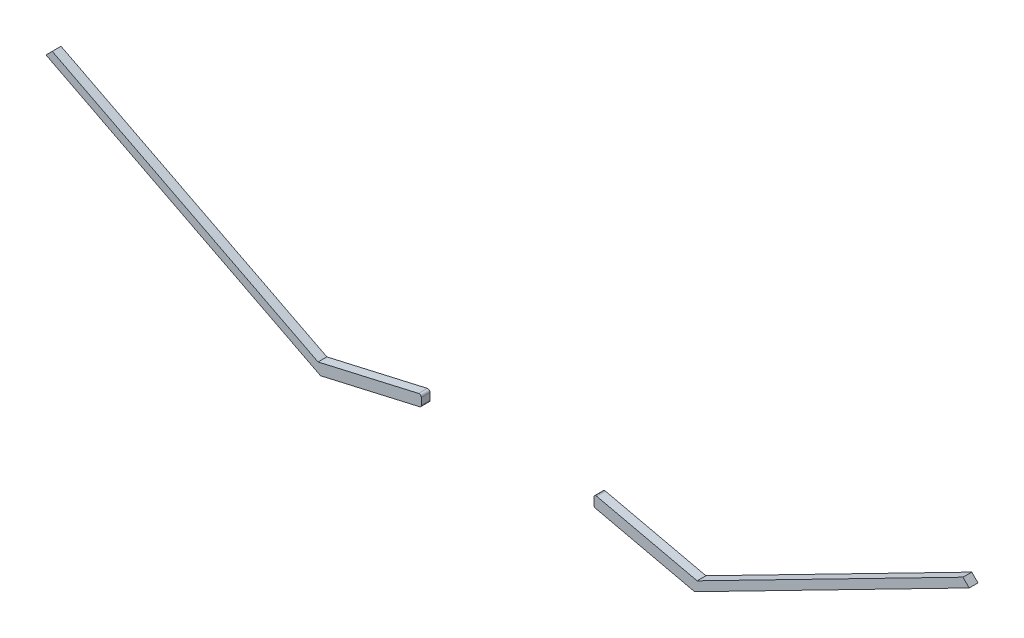
ISO-10303-21;
HEADER;
FILE_DESCRIPTION(('STEP AP214'),'2;1');
FILE_NAME('part.step','',(''),(''),'','','');
FILE_SCHEMA(('AUTOMOTIVE_DESIGN { 1 0 10303 214 1 1 1 1 }'));
ENDSEC;
DATA;
#1=APPLICATION_CONTEXT('core data for automotive mechanical design processes');
#2=APPLICATION_PROTOCOL_DEFINITION('international standard','automotive_design',2000,#1);
#3=PRODUCT_CONTEXT('',#1,'mechanical');
#4=PRODUCT('Part','Part','',(#3));
#5=PRODUCT_RELATED_PRODUCT_CATEGORY('part','',(#4));
#6=PRODUCT_DEFINITION_FORMATION('','',#4);
#7=PRODUCT_DEFINITION_CONTEXT('part definition',#1,'design');
#8=PRODUCT_DEFINITION('design','',#6,#7);
#9=PRODUCT_DEFINITION_SHAPE('','',#8);
#10=(LENGTH_UNIT() NAMED_UNIT(*) SI_UNIT(.MILLI.,.METRE.));
#11=(NAMED_UNIT(*) PLANE_ANGLE_UNIT() SI_UNIT($,.RADIAN.));
#12=(NAMED_UNIT(*) SI_UNIT($,.STERADIAN.) SOLID_ANGLE_UNIT());
#13=UNCERTAINTY_MEASURE_WITH_UNIT(LENGTH_MEASURE(1.E-05),#10,'distance_accuracy_value','');
#14=(GEOMETRIC_REPRESENTATION_CONTEXT(3) GLOBAL_UNCERTAINTY_ASSIGNED_CONTEXT((#13)) GLOBAL_UNIT_ASSIGNED_CONTEXT((#10,
#11,#12)) REPRESENTATION_CONTEXT('',''));
#15=CARTESIAN_POINT('',(0.,0.,0.));
#16=DIRECTION('',(0.,0.,1.));
#17=DIRECTION('',(1.,0.,0.));
#18=AXIS2_PLACEMENT_3D('',#15,#16,#17);
#19=CARTESIAN_POINT('',(20.1115741658573,-9.5000261124462,2.));
#20=DIRECTION('',(0.,0.,-1.));
#21=DIRECTION('',(-1.,0.,0.));
#22=AXIS2_PLACEMENT_3D('',#19,#20,#21);
#23=CYLINDRICAL_SURFACE('',#22,0.499999999999999);
#24=CARTESIAN_POINT('',(20.1115741658573,-9.5000261124462,0.));
#25=DIRECTION('',(0.,0.,1.));
#26=DIRECTION('',(1.,0.,0.));
#27=AXIS2_PLACEMENT_3D('',#24,#25,#26);
#28=CIRCLE('',#27,0.499999999999999);
#29=CARTESIAN_POINT('',(20.2231483317146,-9.01263386228905,0.));
#30=VERTEX_POINT('',#29);
#31=CARTESIAN_POINT('',(19.6115741658573,-9.5000261124462,0.));
#32=VERTEX_POINT('',#31);
#33=EDGE_CURVE('E139',#30,#32,#28,.T.);
#34=ORIENTED_EDGE('',*,*,#33,.T.);
#35=DIRECTION('',(0.,0.,-1.));
#36=VECTOR('',#35,1.);
#37=CARTESIAN_POINT('',(19.6115741658573,-9.5000261124462,2.));
#38=LINE('',#37,#36);
#39=CARTESIAN_POINT('',(19.6115741658573,-9.5000261124462,2.));
#40=VERTEX_POINT('',#39);
#41=EDGE_CURVE('E12',#40,#32,#38,.T.);
#42=ORIENTED_EDGE('',*,*,#41,.F.);
#43=CARTESIAN_POINT('',(20.1115741658573,-9.5000261124462,2.));
#44=DIRECTION('',(0.,0.,1.));
#45=DIRECTION('',(1.,0.,0.));
#46=AXIS2_PLACEMENT_3D('',#43,#44,#45);
#47=CIRCLE('',#46,0.499999999999999);
#48=CARTESIAN_POINT('',(20.2231483317146,-9.01263386228905,2.));
#49=VERTEX_POINT('',#48);
#50=EDGE_CURVE('E153',#49,#40,#47,.T.);
#51=ORIENTED_EDGE('',*,*,#50,.F.);
#52=DIRECTION('',(0.,0.,-1.));
#53=VECTOR('',#52,1.);
#54=CARTESIAN_POINT('',(20.2231483317146,-9.01263386228905,2.));
#55=LINE('',#54,#53);
#56=EDGE_CURVE('E135',#49,#30,#55,.T.);
#57=ORIENTED_EDGE('',*,*,#56,.T.);
#58=EDGE_LOOP('',(#34,#42,#51,#57));
#59=FACE_BOUND('',#58,.T.);
#60=ADVANCED_FACE('F43',(#59),#23,.T.);
#61=CARTESIAN_POINT('',(19.6115741658573,-9.5000261124462,2.));
#62=DIRECTION('',(1.,0.,0.));
#63=DIRECTION('',(0.,0.,-1.));
#64=AXIS2_PLACEMENT_3D('',#61,#62,#63);
#65=PLANE('',#64);
#66=DIRECTION('',(0.,-1.,0.));
#67=VECTOR('',#66,1.);
#68=CARTESIAN_POINT('',(19.6115741658573,-9.5000261124462,0.));
#69=LINE('',#68,#67);
#70=CARTESIAN_POINT('',(19.6115741658573,-11.0388277650334,0.));
#71=VERTEX_POINT('',#70);
#72=EDGE_CURVE('E142',#32,#71,#69,.T.);
#73=ORIENTED_EDGE('',*,*,#72,.T.);
#74=DIRECTION('',(0.,0.,-1.));
#75=VECTOR('',#74,1.);
#76=CARTESIAN_POINT('',(19.6115741658573,-11.0388277650334,2.));
#77=LINE('',#76,#75);
#78=CARTESIAN_POINT('',(19.6115741658573,-11.0388277650334,2.));
#79=VERTEX_POINT('',#78);
#80=EDGE_CURVE('E51',#79,#71,#77,.T.);
#81=ORIENTED_EDGE('',*,*,#80,.F.);
#82=DIRECTION('',(0.,-1.,0.));
#83=VECTOR('',#82,1.);
#84=CARTESIAN_POINT('',(19.6115741658573,-9.5000261124462,2.));
#85=LINE('',#84,#83);
#86=EDGE_CURVE('E102',#40,#79,#85,.T.);
#87=ORIENTED_EDGE('',*,*,#86,.F.);
#88=ORIENTED_EDGE('',*,*,#41,.T.);
#89=EDGE_LOOP('',(#73,#81,#87,#88));
#90=FACE_BOUND('',#89,.T.);
#91=ADVANCED_FACE('F188',(#90),#65,.F.);
#92=CARTESIAN_POINT('',(20.1115741658573,-11.0388277650334,2.));
#93=DIRECTION('',(0.,0.,-1.));
#94=DIRECTION('',(-1.,0.,0.));
#95=AXIS2_PLACEMENT_3D('',#92,#93,#94);
#96=CYLINDRICAL_SURFACE('',#95,0.5);
#97=CARTESIAN_POINT('',(20.1115741658573,-11.0388277650334,0.));
#98=DIRECTION('',(0.,0.,1.));
#99=DIRECTION('',(1.,0.,0.));
#100=AXIS2_PLACEMENT_3D('',#97,#98,#99);
#101=CIRCLE('',#100,0.5);
#102=CARTESIAN_POINT('',(20.,-11.5262200151905,0.));
#103=VERTEX_POINT('',#102);
#104=EDGE_CURVE('E144',#71,#103,#101,.T.);
#105=ORIENTED_EDGE('',*,*,#104,.T.);
#106=DIRECTION('',(0.,0.,-1.));
#107=VECTOR('',#106,1.);
#108=CARTESIAN_POINT('',(20.,-11.5262200151905,2.));
#109=LINE('',#108,#107);
#110=CARTESIAN_POINT('',(20.,-11.5262200151905,2.));
#111=VERTEX_POINT('',#110);
#112=EDGE_CURVE('E160',#111,#103,#109,.T.);
#113=ORIENTED_EDGE('',*,*,#112,.F.);
#114=CARTESIAN_POINT('',(20.1115741658573,-11.0388277650334,2.));
#115=DIRECTION('',(0.,0.,1.));
#116=DIRECTION('',(1.,0.,0.));
#117=AXIS2_PLACEMENT_3D('',#114,#115,#116);
#118=CIRCLE('',#117,0.5);
#119=EDGE_CURVE('E168',#79,#111,#118,.T.);
#120=ORIENTED_EDGE('',*,*,#119,.F.);
#121=ORIENTED_EDGE('',*,*,#80,.T.);
#122=EDGE_LOOP('',(#105,#113,#120,#121));
#123=FACE_BOUND('',#122,.T.);
#124=ADVANCED_FACE('F166',(#123),#96,.T.);
#125=CARTESIAN_POINT('',(20.,-11.5262200151905,2.));
#126=DIRECTION('',(0.223148331714566,0.974784500314303,0.));
#127=DIRECTION('',(-0.974784500314304,0.223148331714566,0.));
#128=AXIS2_PLACEMENT_3D('',#125,#126,#127);
#129=PLANE('',#128);
#130=DIRECTION('',(0.974784500314303,-0.223148331714566,0.));
#131=VECTOR('',#130,1.);
#132=CARTESIAN_POINT('',(20.,-11.5262200151905,0.));
#133=LINE('',#132,#131);
#134=CARTESIAN_POINT('',(42.5,-16.6769353394071,0.));
#135=VERTEX_POINT('',#134);
#136=EDGE_CURVE('E146',#103,#135,#133,.T.);
#137=ORIENTED_EDGE('',*,*,#136,.T.);
#138=DIRECTION('',(0.,0.,-1.));
#139=VECTOR('',#138,1.);
#140=CARTESIAN_POINT('',(42.5,-16.6769353394071,2.));
#141=LINE('',#140,#139);
#142=CARTESIAN_POINT('',(42.5,-16.6769353394071,2.));
#143=VERTEX_POINT('',#142);
#144=EDGE_CURVE('E157',#143,#135,#141,.T.);
#145=ORIENTED_EDGE('',*,*,#144,.F.);
#146=DIRECTION('',(0.974784500314303,-0.223148331714566,0.));
#147=VECTOR('',#146,1.);
#148=CARTESIAN_POINT('',(20.,-11.5262200151905,2.));
#149=LINE('',#148,#147);
#150=EDGE_CURVE('E180',#111,#143,#149,.T.);
#151=ORIENTED_EDGE('',*,*,#150,.F.);
#152=ORIENTED_EDGE('',*,*,#112,.T.);
#153=EDGE_LOOP('',(#137,#145,#151,#152));
#154=FACE_BOUND('',#153,.T.);
#155=ADVANCED_FACE('F176',(#154),#129,.F.);
#156=CARTESIAN_POINT('',(42.5,-16.6769353394071,2.));
#157=DIRECTION('',(-0.455637859415307,0.890165232452626,0.));
#158=DIRECTION('',(-0.890165232452626,-0.455637859415307,0.));
#159=AXIS2_PLACEMENT_3D('',#156,#157,#158);
#160=PLANE('',#159);
#161=DIRECTION('',(0.890165232452626,0.455637859415307,0.));
#162=VECTOR('',#161,1.);
#163=CARTESIAN_POINT('',(42.5,-16.6769353394071,0.));
#164=LINE('',#163,#162);
#165=CARTESIAN_POINT('',(104.899494936612,15.262721777034,0.));
#166=VERTEX_POINT('',#165);
#167=EDGE_CURVE('E148',#135,#166,#164,.T.);
#168=ORIENTED_EDGE('',*,*,#167,.T.);
#169=DIRECTION('',(0.,0.,-1.));
#170=VECTOR('',#169,1.);
#171=CARTESIAN_POINT('',(104.899494936612,15.262721777034,2.));
#172=LINE('',#171,#170);
#173=CARTESIAN_POINT('',(104.899494936612,15.262721777034,2.));
#174=VERTEX_POINT('',#173);
#175=EDGE_CURVE('E130',#174,#166,#172,.T.);
#176=ORIENTED_EDGE('',*,*,#175,.F.);
#177=DIRECTION('',(0.890165232452626,0.455637859415307,0.));
#178=VECTOR('',#177,1.);
#179=CARTESIAN_POINT('',(42.5,-16.6769353394071,2.));
#180=LINE('',#179,#178);
#181=EDGE_CURVE('E121',#143,#174,#180,.T.);
#182=ORIENTED_EDGE('',*,*,#181,.F.);
#183=ORIENTED_EDGE('',*,*,#144,.T.);
#184=EDGE_LOOP('',(#168,#176,#182,#183));
#185=FACE_BOUND('',#184,.T.);
#186=ADVANCED_FACE('F179',(#185),#160,.F.);
#187=CARTESIAN_POINT('',(104.899494936612,15.262721777034,2.));
#188=DIRECTION('',(-0.707106781186547,-0.707106781186547,0.));
#189=DIRECTION('',(0.707106781186548,-0.707106781186548,0.));
#190=AXIS2_PLACEMENT_3D('',#187,#188,#189);
#191=PLANE('',#190);
#192=DIRECTION('',(-0.707106781186547,0.707106781186547,0.));
#193=VECTOR('',#192,1.);
#194=CARTESIAN_POINT('',(104.899494936612,15.262721777034,0.));
#195=LINE('',#194,#193);
#196=CARTESIAN_POINT('',(103.485281374239,16.6769353394071,0.));
#197=VERTEX_POINT('',#196);
#198=EDGE_CURVE('E129',#166,#197,#195,.T.);
#199=ORIENTED_EDGE('',*,*,#198,.T.);
#200=DIRECTION('',(0.,0.,-1.));
#201=VECTOR('',#200,1.);
#202=CARTESIAN_POINT('',(103.485281374239,16.6769353394071,2.));
#203=LINE('',#202,#201);
#204=CARTESIAN_POINT('',(103.485281374239,16.6769353394071,2.));
#205=VERTEX_POINT('',#204);
#206=EDGE_CURVE('E126',#205,#197,#203,.T.);
#207=ORIENTED_EDGE('',*,*,#206,.F.);
#208=DIRECTION('',(-0.707106781186547,0.707106781186547,0.));
#209=VECTOR('',#208,1.);
#210=CARTESIAN_POINT('',(104.899494936612,15.262721777034,2.));
#211=LINE('',#210,#209);
#212=EDGE_CURVE('E115',#174,#205,#211,.T.);
#213=ORIENTED_EDGE('',*,*,#212,.F.);
#214=ORIENTED_EDGE('',*,*,#175,.T.);
#215=EDGE_LOOP('',(#199,#207,#213,#214));
#216=FACE_BOUND('',#215,.T.);
#217=ADVANCED_FACE('F127',(#216),#191,.F.);
#218=CARTESIAN_POINT('',(103.485281374239,16.6769353394071,2.));
#219=DIRECTION('',(0.455637859415307,-0.890165232452626,0.));
#220=DIRECTION('',(0.890165232452626,0.455637859415307,0.));
#221=AXIS2_PLACEMENT_3D('',#218,#219,#220);
#222=PLANE('',#221);
#223=DIRECTION('',(-0.890165232452626,-0.455637859415307,0.));
#224=VECTOR('',#223,1.);
#225=CARTESIAN_POINT('',(103.485281374239,16.6769353394071,0.));
#226=LINE('',#225,#224);
#227=CARTESIAN_POINT('',(43.0758536191276,-14.2440907211195,0.));
#228=VERTEX_POINT('',#227);
#229=EDGE_CURVE('E88',#197,#228,#226,.T.);
#230=ORIENTED_EDGE('',*,*,#229,.T.);
#231=DIRECTION('',(0.,0.,-1.));
#232=VECTOR('',#231,1.);
#233=CARTESIAN_POINT('',(43.0758536191276,-14.2440907211195,2.));
#234=LINE('',#233,#232);
#235=CARTESIAN_POINT('',(43.0758536191276,-14.2440907211195,2.));
#236=VERTEX_POINT('',#235);
#237=EDGE_CURVE('E131',#236,#228,#234,.T.);
#238=ORIENTED_EDGE('',*,*,#237,.F.);
#239=DIRECTION('',(-0.890165232452626,-0.455637859415307,0.));
#240=VECTOR('',#239,1.);
#241=CARTESIAN_POINT('',(103.485281374239,16.6769353394071,2.));
#242=LINE('',#241,#240);
#243=EDGE_CURVE('E119',#205,#236,#242,.T.);
#244=ORIENTED_EDGE('',*,*,#243,.F.);
#245=ORIENTED_EDGE('',*,*,#206,.T.);
#246=EDGE_LOOP('',(#230,#238,#244,#245));
#247=FACE_BOUND('',#246,.T.);
#248=ADVANCED_FACE('F133',(#247),#222,.F.);
#249=CARTESIAN_POINT('',(43.0758536191276,-14.2440907211195,2.));
#250=DIRECTION('',(-0.223148331714565,-0.974784500314304,0.));
#251=DIRECTION('',(0.974784500314304,-0.223148331714565,0.));
#252=AXIS2_PLACEMENT_3D('',#249,#250,#251);
#253=PLANE('',#252);
#254=DIRECTION('',(-0.974784500314304,0.223148331714565,0.));
#255=VECTOR('',#254,1.);
#256=CARTESIAN_POINT('',(43.0758536191276,-14.2440907211195,0.));
#257=LINE('',#256,#255);
#258=EDGE_CURVE('E94',#228,#30,#257,.T.);
#259=ORIENTED_EDGE('',*,*,#258,.T.);
#260=ORIENTED_EDGE('',*,*,#56,.F.);
#261=DIRECTION('',(-0.974784500314304,0.223148331714565,0.));
#262=VECTOR('',#261,1.);
#263=CARTESIAN_POINT('',(43.0758536191276,-14.2440907211195,2.));
#264=LINE('',#263,#262);
#265=EDGE_CURVE('E59',#236,#49,#264,.T.);
#266=ORIENTED_EDGE('',*,*,#265,.F.);
#267=ORIENTED_EDGE('',*,*,#237,.T.);
#268=EDGE_LOOP('',(#259,#260,#266,#267));
#269=FACE_BOUND('',#268,.T.);
#270=ADVANCED_FACE('F204',(#269),#253,.F.);
#271=CARTESIAN_POINT('',(20.1115741658573,-9.5000261124462,2.));
#272=DIRECTION('',(0.,0.,1.));
#273=DIRECTION('',(1.,0.,0.));
#274=AXIS2_PLACEMENT_3D('',#271,#272,#273);
#275=PLANE('',#274);
#276=ORIENTED_EDGE('',*,*,#50,.T.);
#277=ORIENTED_EDGE('',*,*,#86,.T.);
#278=ORIENTED_EDGE('',*,*,#119,.T.);
#279=ORIENTED_EDGE('',*,*,#150,.T.);
#280=ORIENTED_EDGE('',*,*,#181,.T.);
#281=ORIENTED_EDGE('',*,*,#212,.T.);
#282=ORIENTED_EDGE('',*,*,#243,.T.);
#283=ORIENTED_EDGE('',*,*,#265,.T.);
#284=EDGE_LOOP('',(#276,#277,#278,#279,#280,#281,#282,#283));
#285=FACE_BOUND('',#284,.T.);
#286=ADVANCED_FACE('F117',(#285),#275,.T.);
#287=CARTESIAN_POINT('',(20.1115741658573,-9.5000261124462,0.));
#288=DIRECTION('',(0.,0.,1.));
#289=DIRECTION('',(1.,0.,0.));
#290=AXIS2_PLACEMENT_3D('',#287,#288,#289);
#291=PLANE('',#290);
#292=ORIENTED_EDGE('',*,*,#33,.F.);
#293=ORIENTED_EDGE('',*,*,#258,.F.);
#294=ORIENTED_EDGE('',*,*,#229,.F.);
#295=ORIENTED_EDGE('',*,*,#198,.F.);
#296=ORIENTED_EDGE('',*,*,#167,.F.);
#297=ORIENTED_EDGE('',*,*,#136,.F.);
#298=ORIENTED_EDGE('',*,*,#104,.F.);
#299=ORIENTED_EDGE('',*,*,#72,.F.);
#300=EDGE_LOOP('',(#292,#293,#294,#295,#296,#297,#298,#299));
#301=FACE_BOUND('',#300,.T.);
#302=ADVANCED_FACE('F172',(#301),#291,.F.);
#303=CLOSED_SHELL('',(#60,#91,#124,#155,#186,#217,#248,#270,#286,#302));
#304=MANIFOLD_SOLID_BREP('B2',#303);
#305=CARTESIAN_POINT('',(-104.899494936612,15.262721777034,2.));
#306=DIRECTION('',(0.707106781186547,-0.707106781186547,0.));
#307=DIRECTION('',(0.707106781186548,0.707106781186548,0.));
#308=AXIS2_PLACEMENT_3D('',#305,#306,#307);
#309=PLANE('',#308);
#310=DIRECTION('',(-0.707106781186547,-0.707106781186547,0.));
#311=VECTOR('',#310,1.);
#312=CARTESIAN_POINT('',(-104.899494936612,15.262721777034,0.));
#313=LINE('',#312,#311);
#314=CARTESIAN_POINT('',(-103.485281374239,16.6769353394071,0.));
#315=VERTEX_POINT('',#314);
#316=CARTESIAN_POINT('',(-104.899494936612,15.262721777034,0.));
#317=VERTEX_POINT('',#316);
#318=EDGE_CURVE('E367',#315,#317,#313,.T.);
#319=ORIENTED_EDGE('',*,*,#318,.T.);
#320=DIRECTION('',(0.,0.,-1.));
#321=VECTOR('',#320,1.);
#322=CARTESIAN_POINT('',(-104.899494936612,15.262721777034,2.));
#323=LINE('',#322,#321);
#324=CARTESIAN_POINT('',(-104.899494936612,15.262721777034,2.));
#325=VERTEX_POINT('',#324);
#326=EDGE_CURVE('E41',#325,#317,#323,.T.);
#327=ORIENTED_EDGE('',*,*,#326,.F.);
#328=DIRECTION('',(-0.707106781186547,-0.707106781186547,0.));
#329=VECTOR('',#328,1.);
#330=CARTESIAN_POINT('',(-104.899494936612,15.262721777034,2.));
#331=LINE('',#330,#329);
#332=CARTESIAN_POINT('',(-103.485281374239,16.6769353394071,2.));
#333=VERTEX_POINT('',#332);
#334=EDGE_CURVE('E381',#333,#325,#331,.T.);
#335=ORIENTED_EDGE('',*,*,#334,.F.);
#336=DIRECTION('',(0.,0.,-1.));
#337=VECTOR('',#336,1.);
#338=CARTESIAN_POINT('',(-103.485281374239,16.6769353394071,2.));
#339=LINE('',#338,#337);
#340=EDGE_CURVE('E363',#333,#315,#339,.T.);
#341=ORIENTED_EDGE('',*,*,#340,.T.);
#342=EDGE_LOOP('',(#319,#327,#335,#341));
#343=FACE_BOUND('',#342,.T.);
#344=ADVANCED_FACE('F271',(#343),#309,.F.);
#345=CARTESIAN_POINT('',(-42.5,-16.6769353394071,2.));
#346=DIRECTION('',(0.455637859415307,0.890165232452626,0.));
#347=DIRECTION('',(-0.890165232452626,0.455637859415307,0.));
#348=AXIS2_PLACEMENT_3D('',#345,#346,#347);
#349=PLANE('',#348);
#350=DIRECTION('',(0.890165232452626,-0.455637859415307,0.));
#351=VECTOR('',#350,1.);
#352=CARTESIAN_POINT('',(-42.5,-16.6769353394071,0.));
#353=LINE('',#352,#351);
#354=CARTESIAN_POINT('',(-42.5,-16.6769353394071,0.));
#355=VERTEX_POINT('',#354);
#356=EDGE_CURVE('E370',#317,#355,#353,.T.);
#357=ORIENTED_EDGE('',*,*,#356,.T.);
#358=DIRECTION('',(0.,0.,-1.));
#359=VECTOR('',#358,1.);
#360=CARTESIAN_POINT('',(-42.5,-16.6769353394071,2.));
#361=LINE('',#360,#359);
#362=CARTESIAN_POINT('',(-42.5,-16.6769353394071,2.));
#363=VERTEX_POINT('',#362);
#364=EDGE_CURVE('E279',#363,#355,#361,.T.);
#365=ORIENTED_EDGE('',*,*,#364,.F.);
#366=DIRECTION('',(0.890165232452626,-0.455637859415307,0.));
#367=VECTOR('',#366,1.);
#368=CARTESIAN_POINT('',(-42.5,-16.6769353394071,2.));
#369=LINE('',#368,#367);
#370=EDGE_CURVE('E330',#325,#363,#369,.T.);
#371=ORIENTED_EDGE('',*,*,#370,.F.);
#372=ORIENTED_EDGE('',*,*,#326,.T.);
#373=EDGE_LOOP('',(#357,#365,#371,#372));
#374=FACE_BOUND('',#373,.T.);
#375=ADVANCED_FACE('F416',(#374),#349,.F.);
#376=CARTESIAN_POINT('',(-20.,-11.5262200151905,2.));
#377=DIRECTION('',(-0.223148331714566,0.974784500314303,0.));
#378=DIRECTION('',(-0.974784500314303,-0.223148331714566,0.));
#379=AXIS2_PLACEMENT_3D('',#376,#377,#378);
#380=PLANE('',#379);
#381=DIRECTION('',(0.974784500314303,0.223148331714566,0.));
#382=VECTOR('',#381,1.);
#383=CARTESIAN_POINT('',(-20.,-11.5262200151905,0.));
#384=LINE('',#383,#382);
#385=CARTESIAN_POINT('',(-20.,-11.5262200151905,0.));
#386=VERTEX_POINT('',#385);
#387=EDGE_CURVE('E372',#355,#386,#384,.T.);
#388=ORIENTED_EDGE('',*,*,#387,.T.);
#389=DIRECTION('',(0.,0.,-1.));
#390=VECTOR('',#389,1.);
#391=CARTESIAN_POINT('',(-20.,-11.5262200151905,2.));
#392=LINE('',#391,#390);
#393=CARTESIAN_POINT('',(-20.,-11.5262200151905,2.));
#394=VERTEX_POINT('',#393);
#395=EDGE_CURVE('E388',#394,#386,#392,.T.);
#396=ORIENTED_EDGE('',*,*,#395,.F.);
#397=DIRECTION('',(0.974784500314303,0.223148331714566,0.));
#398=VECTOR('',#397,1.);
#399=CARTESIAN_POINT('',(-20.,-11.5262200151905,2.));
#400=LINE('',#399,#398);
#401=EDGE_CURVE('E396',#363,#394,#400,.T.);
#402=ORIENTED_EDGE('',*,*,#401,.F.);
#403=ORIENTED_EDGE('',*,*,#364,.T.);
#404=EDGE_LOOP('',(#388,#396,#402,#403));
#405=FACE_BOUND('',#404,.T.);
#406=ADVANCED_FACE('F394',(#405),#380,.F.);
#407=CARTESIAN_POINT('',(-20.1115741658573,-11.0388277650334,2.));
#408=DIRECTION('',(0.,0.,-1.));
#409=DIRECTION('',(-1.,0.,0.));
#410=AXIS2_PLACEMENT_3D('',#407,#408,#409);
#411=CYLINDRICAL_SURFACE('',#410,0.500000000000001);
#412=CARTESIAN_POINT('',(-20.1115741658573,-11.0388277650334,0.));
#413=DIRECTION('',(0.,0.,1.));
#414=DIRECTION('',(-1.,0.,0.));
#415=AXIS2_PLACEMENT_3D('',#412,#413,#414);
#416=CIRCLE('',#415,0.500000000000001);
#417=CARTESIAN_POINT('',(-19.6115741658573,-11.0388277650334,0.));
#418=VERTEX_POINT('',#417);
#419=EDGE_CURVE('E374',#386,#418,#416,.T.);
#420=ORIENTED_EDGE('',*,*,#419,.T.);
#421=DIRECTION('',(0.,0.,-1.));
#422=VECTOR('',#421,1.);
#423=CARTESIAN_POINT('',(-19.6115741658573,-11.0388277650334,2.));
#424=LINE('',#423,#422);
#425=CARTESIAN_POINT('',(-19.6115741658573,-11.0388277650334,2.));
#426=VERTEX_POINT('',#425);
#427=EDGE_CURVE('E385',#426,#418,#424,.T.);
#428=ORIENTED_EDGE('',*,*,#427,.F.);
#429=CARTESIAN_POINT('',(-20.1115741658573,-11.0388277650334,2.));
#430=DIRECTION('',(0.,0.,1.));
#431=DIRECTION('',(-1.,0.,0.));
#432=AXIS2_PLACEMENT_3D('',#429,#430,#431);
#433=CIRCLE('',#432,0.500000000000001);
#434=EDGE_CURVE('E408',#394,#426,#433,.T.);
#435=ORIENTED_EDGE('',*,*,#434,.F.);
#436=ORIENTED_EDGE('',*,*,#395,.T.);
#437=EDGE_LOOP('',(#420,#428,#435,#436));
#438=FACE_BOUND('',#437,.T.);
#439=ADVANCED_FACE('F404',(#438),#411,.T.);
#440=CARTESIAN_POINT('',(-19.6115741658573,-9.5000261124462,2.));
#441=DIRECTION('',(-1.,0.,0.));
#442=DIRECTION('',(0.,0.,1.));
#443=AXIS2_PLACEMENT_3D('',#440,#441,#442);
#444=PLANE('',#443);
#445=DIRECTION('',(0.,1.,0.));
#446=VECTOR('',#445,1.);
#447=CARTESIAN_POINT('',(-19.6115741658573,-9.5000261124462,0.));
#448=LINE('',#447,#446);
#449=CARTESIAN_POINT('',(-19.6115741658573,-9.5000261124462,0.));
#450=VERTEX_POINT('',#449);
#451=EDGE_CURVE('E376',#418,#450,#448,.T.);
#452=ORIENTED_EDGE('',*,*,#451,.T.);
#453=DIRECTION('',(0.,0.,-1.));
#454=VECTOR('',#453,1.);
#455=CARTESIAN_POINT('',(-19.6115741658573,-9.5000261124462,2.));
#456=LINE('',#455,#454);
#457=CARTESIAN_POINT('',(-19.6115741658573,-9.5000261124462,2.));
#458=VERTEX_POINT('',#457);
#459=EDGE_CURVE('E358',#458,#450,#456,.T.);
#460=ORIENTED_EDGE('',*,*,#459,.F.);
#461=DIRECTION('',(0.,1.,0.));
#462=VECTOR('',#461,1.);
#463=CARTESIAN_POINT('',(-19.6115741658573,-9.5000261124462,2.));
#464=LINE('',#463,#462);
#465=EDGE_CURVE('E349',#426,#458,#464,.T.);
#466=ORIENTED_EDGE('',*,*,#465,.F.);
#467=ORIENTED_EDGE('',*,*,#427,.T.);
#468=EDGE_LOOP('',(#452,#460,#466,#467));
#469=FACE_BOUND('',#468,.T.);
#470=ADVANCED_FACE('F407',(#469),#444,.F.);
#471=CARTESIAN_POINT('',(-20.1115741658573,-9.5000261124462,2.));
#472=DIRECTION('',(0.,0.,-1.));
#473=DIRECTION('',(-1.,0.,0.));
#474=AXIS2_PLACEMENT_3D('',#471,#472,#473);
#475=CYLINDRICAL_SURFACE('',#474,0.5);
#476=CARTESIAN_POINT('',(-20.1115741658573,-9.5000261124462,0.));
#477=DIRECTION('',(0.,0.,1.));
#478=DIRECTION('',(-1.,0.,0.));
#479=AXIS2_PLACEMENT_3D('',#476,#477,#478);
#480=CIRCLE('',#479,0.5);
#481=CARTESIAN_POINT('',(-20.2231483317146,-9.01263386228905,0.));
#482=VERTEX_POINT('',#481);
#483=EDGE_CURVE('E357',#450,#482,#480,.T.);
#484=ORIENTED_EDGE('',*,*,#483,.T.);
#485=DIRECTION('',(0.,0.,-1.));
#486=VECTOR('',#485,1.);
#487=CARTESIAN_POINT('',(-20.2231483317146,-9.01263386228905,2.));
#488=LINE('',#487,#486);
#489=CARTESIAN_POINT('',(-20.2231483317146,-9.01263386228905,2.));
#490=VERTEX_POINT('',#489);
#491=EDGE_CURVE('E354',#490,#482,#488,.T.);
#492=ORIENTED_EDGE('',*,*,#491,.F.);
#493=CARTESIAN_POINT('',(-20.1115741658573,-9.5000261124462,2.));
#494=DIRECTION('',(0.,0.,1.));
#495=DIRECTION('',(-1.,0.,0.));
#496=AXIS2_PLACEMENT_3D('',#493,#494,#495);
#497=CIRCLE('',#496,0.5);
#498=EDGE_CURVE('E343',#458,#490,#497,.T.);
#499=ORIENTED_EDGE('',*,*,#498,.F.);
#500=ORIENTED_EDGE('',*,*,#459,.T.);
#501=EDGE_LOOP('',(#484,#492,#499,#500));
#502=FACE_BOUND('',#501,.T.);
#503=ADVANCED_FACE('F355',(#502),#475,.T.);
#504=CARTESIAN_POINT('',(-43.0758536191276,-14.2440907211195,2.));
#505=DIRECTION('',(0.223148331714566,-0.974784500314303,0.));
#506=DIRECTION('',(0.974784500314304,0.223148331714566,0.));
#507=AXIS2_PLACEMENT_3D('',#504,#505,#506);
#508=PLANE('',#507);
#509=DIRECTION('',(-0.974784500314304,-0.223148331714566,0.));
#510=VECTOR('',#509,1.);
#511=CARTESIAN_POINT('',(-43.0758536191276,-14.2440907211195,0.));
#512=LINE('',#511,#510);
#513=CARTESIAN_POINT('',(-43.0758536191276,-14.2440907211195,0.));
#514=VERTEX_POINT('',#513);
#515=EDGE_CURVE('E316',#482,#514,#512,.T.);
#516=ORIENTED_EDGE('',*,*,#515,.T.);
#517=DIRECTION('',(0.,0.,-1.));
#518=VECTOR('',#517,1.);
#519=CARTESIAN_POINT('',(-43.0758536191276,-14.2440907211195,2.));
#520=LINE('',#519,#518);
#521=CARTESIAN_POINT('',(-43.0758536191276,-14.2440907211195,2.));
#522=VERTEX_POINT('',#521);
#523=EDGE_CURVE('E359',#522,#514,#520,.T.);
#524=ORIENTED_EDGE('',*,*,#523,.F.);
#525=DIRECTION('',(-0.974784500314304,-0.223148331714566,0.));
#526=VECTOR('',#525,1.);
#527=CARTESIAN_POINT('',(-43.0758536191276,-14.2440907211195,2.));
#528=LINE('',#527,#526);
#529=EDGE_CURVE('E347',#490,#522,#528,.T.);
#530=ORIENTED_EDGE('',*,*,#529,.F.);
#531=ORIENTED_EDGE('',*,*,#491,.T.);
#532=EDGE_LOOP('',(#516,#524,#530,#531));
#533=FACE_BOUND('',#532,.T.);
#534=ADVANCED_FACE('F361',(#533),#508,.F.);
#535=CARTESIAN_POINT('',(-103.485281374239,16.6769353394071,2.));
#536=DIRECTION('',(-0.455637859415307,-0.890165232452626,0.));
#537=DIRECTION('',(0.890165232452626,-0.455637859415307,0.));
#538=AXIS2_PLACEMENT_3D('',#535,#536,#537);
#539=PLANE('',#538);
#540=DIRECTION('',(-0.890165232452626,0.455637859415307,0.));
#541=VECTOR('',#540,1.);
#542=CARTESIAN_POINT('',(-103.485281374239,16.6769353394071,0.));
#543=LINE('',#542,#541);
#544=EDGE_CURVE('E322',#514,#315,#543,.T.);
#545=ORIENTED_EDGE('',*,*,#544,.T.);
#546=ORIENTED_EDGE('',*,*,#340,.F.);
#547=DIRECTION('',(-0.890165232452626,0.455637859415307,0.));
#548=VECTOR('',#547,1.);
#549=CARTESIAN_POINT('',(-103.485281374239,16.6769353394071,2.));
#550=LINE('',#549,#548);
#551=EDGE_CURVE('E287',#522,#333,#550,.T.);
#552=ORIENTED_EDGE('',*,*,#551,.F.);
#553=ORIENTED_EDGE('',*,*,#523,.T.);
#554=EDGE_LOOP('',(#545,#546,#552,#553));
#555=FACE_BOUND('',#554,.T.);
#556=ADVANCED_FACE('F432',(#555),#539,.F.);
#557=CARTESIAN_POINT('',(-20.1115741658573,-9.5000261124462,2.));
#558=DIRECTION('',(0.,0.,-1.));
#559=DIRECTION('',(-1.,0.,0.));
#560=AXIS2_PLACEMENT_3D('',#557,#558,#559);
#561=PLANE('',#560);
#562=ORIENTED_EDGE('',*,*,#334,.T.);
#563=ORIENTED_EDGE('',*,*,#370,.T.);
#564=ORIENTED_EDGE('',*,*,#401,.T.);
#565=ORIENTED_EDGE('',*,*,#434,.T.);
#566=ORIENTED_EDGE('',*,*,#465,.T.);
#567=ORIENTED_EDGE('',*,*,#498,.T.);
#568=ORIENTED_EDGE('',*,*,#529,.T.);
#569=ORIENTED_EDGE('',*,*,#551,.T.);
#570=EDGE_LOOP('',(#562,#563,#564,#565,#566,#567,#568,#569));
#571=FACE_BOUND('',#570,.T.);
#572=ADVANCED_FACE('F345',(#571),#561,.F.);
#573=CARTESIAN_POINT('',(-20.1115741658573,-9.5000261124462,0.));
#574=DIRECTION('',(0.,0.,-1.));
#575=DIRECTION('',(-1.,0.,0.));
#576=AXIS2_PLACEMENT_3D('',#573,#574,#575);
#577=PLANE('',#576);
#578=ORIENTED_EDGE('',*,*,#318,.F.);
#579=ORIENTED_EDGE('',*,*,#544,.F.);
#580=ORIENTED_EDGE('',*,*,#515,.F.);
#581=ORIENTED_EDGE('',*,*,#483,.F.);
#582=ORIENTED_EDGE('',*,*,#451,.F.);
#583=ORIENTED_EDGE('',*,*,#419,.F.);
#584=ORIENTED_EDGE('',*,*,#387,.F.);
#585=ORIENTED_EDGE('',*,*,#356,.F.);
#586=EDGE_LOOP('',(#578,#579,#580,#581,#582,#583,#584,#585));
#587=FACE_BOUND('',#586,.T.);
#588=ADVANCED_FACE('F400',(#587),#577,.T.);
#589=CLOSED_SHELL('',(#344,#375,#406,#439,#470,#503,#534,#556,#572,#588));
#590=MANIFOLD_SOLID_BREP('B6',#589);
#591=ADVANCED_BREP_SHAPE_REPRESENTATION('',(#18,#304,#590),#14);
#592=SHAPE_DEFINITION_REPRESENTATION(#9,#591);
ENDSEC;
END-ISO-10303-21;
